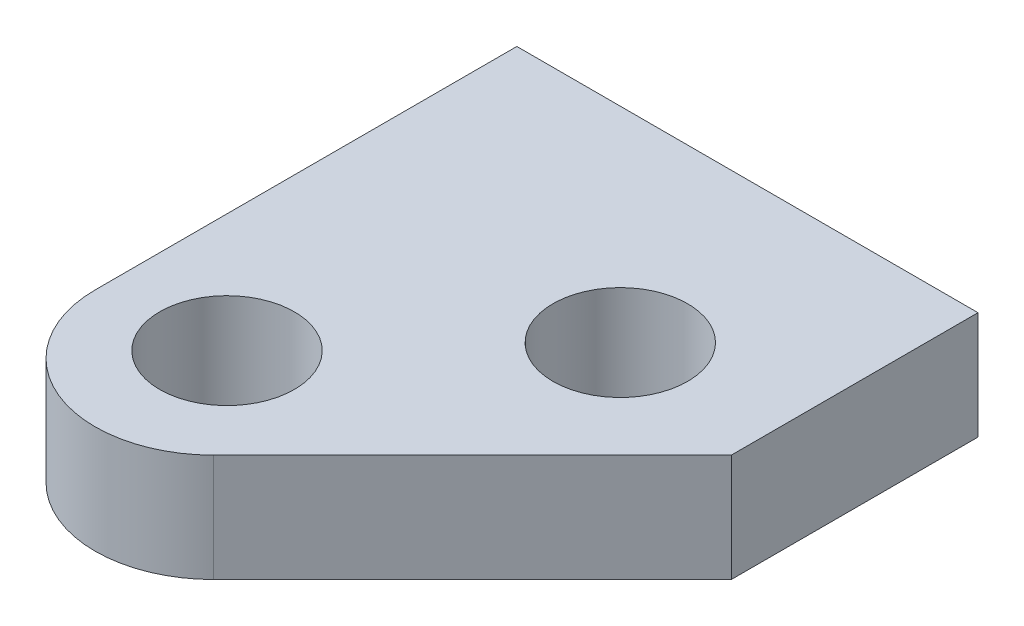
ISO-10303-21;
HEADER;
FILE_DESCRIPTION(('STEP AP214'),'2;1');
FILE_NAME('part.step','',(''),(''),'','','');
FILE_SCHEMA(('AUTOMOTIVE_DESIGN { 1 0 10303 214 1 1 1 1 }'));
ENDSEC;
DATA;
#1=APPLICATION_CONTEXT('core data for automotive mechanical design processes');
#2=APPLICATION_PROTOCOL_DEFINITION('international standard','automotive_design',2000,#1);
#3=PRODUCT_CONTEXT('',#1,'mechanical');
#4=PRODUCT('Part','Part','',(#3));
#5=PRODUCT_RELATED_PRODUCT_CATEGORY('part','',(#4));
#6=PRODUCT_DEFINITION_FORMATION('','',#4);
#7=PRODUCT_DEFINITION_CONTEXT('part definition',#1,'design');
#8=PRODUCT_DEFINITION('design','',#6,#7);
#9=PRODUCT_DEFINITION_SHAPE('','',#8);
#10=(LENGTH_UNIT() NAMED_UNIT(*) SI_UNIT(.MILLI.,.METRE.));
#11=(NAMED_UNIT(*) PLANE_ANGLE_UNIT() SI_UNIT($,.RADIAN.));
#12=(NAMED_UNIT(*) SI_UNIT($,.STERADIAN.) SOLID_ANGLE_UNIT());
#13=UNCERTAINTY_MEASURE_WITH_UNIT(LENGTH_MEASURE(1.E-05),#10,'distance_accuracy_value','');
#14=(GEOMETRIC_REPRESENTATION_CONTEXT(3) GLOBAL_UNCERTAINTY_ASSIGNED_CONTEXT((#13)) GLOBAL_UNIT_ASSIGNED_CONTEXT((#10,
#11,#12)) REPRESENTATION_CONTEXT('',''));
#15=CARTESIAN_POINT('',(0.,0.,0.));
#16=DIRECTION('',(0.,0.,1.));
#17=DIRECTION('',(1.,0.,0.));
#18=AXIS2_PLACEMENT_3D('',#15,#16,#17);
#19=CARTESIAN_POINT('',(0.,10.,0.));
#20=DIRECTION('',(0.,-1.,0.));
#21=DIRECTION('',(0.,0.,-1.));
#22=AXIS2_PLACEMENT_3D('',#19,#20,#21);
#23=PLANE('',#22);
#24=CARTESIAN_POINT('',(11.,10.,37.9));
#25=DIRECTION('',(0.,1.,0.));
#26=DIRECTION('',(0.,0.,1.));
#27=AXIS2_PLACEMENT_3D('',#24,#25,#26);
#28=CIRCLE('',#27,6.25);
#29=CARTESIAN_POINT('',(11.,10.,44.15));
#30=VERTEX_POINT('',#29);
#31=EDGE_CURVE('E118',#30,#30,#28,.T.);
#32=ORIENTED_EDGE('',*,*,#31,.F.);
#33=EDGE_LOOP('',(#32));
#34=FACE_BOUND('',#33,.T.);
#35=DIRECTION('',(0.,0.,1.));
#36=VECTOR('',#35,1.);
#37=CARTESIAN_POINT('',(0.,10.,0.));
#38=LINE('',#37,#36);
#39=CARTESIAN_POINT('',(0.,10.,0.));
#40=VERTEX_POINT('',#39);
#41=CARTESIAN_POINT('',(0.,10.,39.1436508138959));
#42=VERTEX_POINT('',#41);
#43=EDGE_CURVE('E78',#40,#42,#38,.T.);
#44=ORIENTED_EDGE('',*,*,#43,.T.);
#45=CARTESIAN_POINT('',(11.,10.,39.1436508138959));
#46=DIRECTION('',(0.,-1.,0.));
#47=DIRECTION('',(0.,0.,-1.));
#48=AXIS2_PLACEMENT_3D('',#45,#46,#47);
#49=CIRCLE('',#48,11.);
#50=CARTESIAN_POINT('',(18.778174593052,10.,46.9218254069479));
#51=VERTEX_POINT('',#50);
#52=EDGE_CURVE('E11',#42,#51,#49,.F.);
#53=ORIENTED_EDGE('',*,*,#52,.T.);
#54=DIRECTION('',(0.707106781186549,0.,-0.707106781186546));
#55=VECTOR('',#54,1.);
#56=CARTESIAN_POINT('',(42.8,10.,22.9));
#57=LINE('',#56,#55);
#58=CARTESIAN_POINT('',(42.8,10.,22.9));
#59=VERTEX_POINT('',#58);
#60=EDGE_CURVE('E86',#51,#59,#57,.T.);
#61=ORIENTED_EDGE('',*,*,#60,.T.);
#62=DIRECTION('',(0.,0.,-1.));
#63=VECTOR('',#62,1.);
#64=CARTESIAN_POINT('',(42.8,10.,0.));
#65=LINE('',#64,#63);
#66=CARTESIAN_POINT('',(42.8,10.,0.));
#67=VERTEX_POINT('',#66);
#68=EDGE_CURVE('E92',#59,#67,#65,.T.);
#69=ORIENTED_EDGE('',*,*,#68,.T.);
#70=DIRECTION('',(-1.,0.,0.));
#71=VECTOR('',#70,1.);
#72=CARTESIAN_POINT('',(0.,10.,0.));
#73=LINE('',#72,#71);
#74=EDGE_CURVE('E87',#67,#40,#73,.T.);
#75=ORIENTED_EDGE('',*,*,#74,.T.);
#76=EDGE_LOOP('',(#44,#53,#61,#69,#75));
#77=FACE_BOUND('',#76,.T.);
#78=CARTESIAN_POINT('',(28.6,10.,19.));
#79=DIRECTION('',(0.,1.,0.));
#80=DIRECTION('',(0.,0.,1.));
#81=AXIS2_PLACEMENT_3D('',#78,#79,#80);
#82=CIRCLE('',#81,6.25);
#83=CARTESIAN_POINT('',(28.6,10.,25.25));
#84=VERTEX_POINT('',#83);
#85=EDGE_CURVE('E124',#84,#84,#82,.T.);
#86=ORIENTED_EDGE('',*,*,#85,.F.);
#87=EDGE_LOOP('',(#86));
#88=FACE_BOUND('',#87,.T.);
#89=ADVANCED_FACE('F35',(#34,#77,#88),#23,.F.);
#90=CARTESIAN_POINT('',(0.,0.,0.));
#91=DIRECTION('',(0.,-1.,0.));
#92=DIRECTION('',(0.,0.,-1.));
#93=AXIS2_PLACEMENT_3D('',#90,#91,#92);
#94=PLANE('',#93);
#95=CARTESIAN_POINT('',(11.,0.,37.9));
#96=DIRECTION('',(0.,1.,0.));
#97=DIRECTION('',(0.,0.,1.));
#98=AXIS2_PLACEMENT_3D('',#95,#96,#97);
#99=CIRCLE('',#98,6.25);
#100=CARTESIAN_POINT('',(11.,0.,44.15));
#101=VERTEX_POINT('',#100);
#102=EDGE_CURVE('E121',#101,#101,#99,.T.);
#103=ORIENTED_EDGE('',*,*,#102,.T.);
#104=EDGE_LOOP('',(#103));
#105=FACE_BOUND('',#104,.T.);
#106=DIRECTION('',(0.707106781186549,0.,-0.707106781186546));
#107=VECTOR('',#106,1.);
#108=CARTESIAN_POINT('',(42.8,0.,22.9));
#109=LINE('',#108,#107);
#110=CARTESIAN_POINT('',(18.778174593052,0.,46.9218254069479));
#111=VERTEX_POINT('',#110);
#112=CARTESIAN_POINT('',(42.8,0.,22.9));
#113=VERTEX_POINT('',#112);
#114=EDGE_CURVE('E113',#111,#113,#109,.T.);
#115=ORIENTED_EDGE('',*,*,#114,.F.);
#116=CARTESIAN_POINT('',(11.,0.,39.1436508138959));
#117=DIRECTION('',(0.,-1.,0.));
#118=DIRECTION('',(0.,0.,-1.));
#119=AXIS2_PLACEMENT_3D('',#116,#117,#118);
#120=CIRCLE('',#119,11.);
#121=CARTESIAN_POINT('',(0.,0.,39.1436508138959));
#122=VERTEX_POINT('',#121);
#123=EDGE_CURVE('E57',#111,#122,#120,.T.);
#124=ORIENTED_EDGE('',*,*,#123,.T.);
#125=DIRECTION('',(0.,0.,1.));
#126=VECTOR('',#125,1.);
#127=CARTESIAN_POINT('',(0.,0.,37.9));
#128=LINE('',#127,#126);
#129=CARTESIAN_POINT('',(0.,0.,0.));
#130=VERTEX_POINT('',#129);
#131=EDGE_CURVE('E115',#130,#122,#128,.T.);
#132=ORIENTED_EDGE('',*,*,#131,.F.);
#133=DIRECTION('',(-1.,0.,0.));
#134=VECTOR('',#133,1.);
#135=CARTESIAN_POINT('',(0.,0.,0.));
#136=LINE('',#135,#134);
#137=CARTESIAN_POINT('',(42.8,0.,0.));
#138=VERTEX_POINT('',#137);
#139=EDGE_CURVE('E100',#138,#130,#136,.T.);
#140=ORIENTED_EDGE('',*,*,#139,.F.);
#141=DIRECTION('',(0.,0.,-1.));
#142=VECTOR('',#141,1.);
#143=CARTESIAN_POINT('',(42.8,0.,0.));
#144=LINE('',#143,#142);
#145=EDGE_CURVE('E96',#113,#138,#144,.T.);
#146=ORIENTED_EDGE('',*,*,#145,.F.);
#147=EDGE_LOOP('',(#115,#124,#132,#140,#146));
#148=FACE_BOUND('',#147,.T.);
#149=CARTESIAN_POINT('',(28.6,0.,19.));
#150=DIRECTION('',(0.,1.,0.));
#151=DIRECTION('',(0.,0.,1.));
#152=AXIS2_PLACEMENT_3D('',#149,#150,#151);
#153=CIRCLE('',#152,6.25);
#154=CARTESIAN_POINT('',(28.6,0.,25.25));
#155=VERTEX_POINT('',#154);
#156=EDGE_CURVE('E127',#155,#155,#153,.T.);
#157=ORIENTED_EDGE('',*,*,#156,.T.);
#158=EDGE_LOOP('',(#157));
#159=FACE_BOUND('',#158,.T.);
#160=ADVANCED_FACE('F175',(#105,#148,#159),#94,.T.);
#161=CARTESIAN_POINT('',(0.,10.,0.));
#162=DIRECTION('',(0.,0.,1.));
#163=DIRECTION('',(1.,0.,0.));
#164=AXIS2_PLACEMENT_3D('',#161,#162,#163);
#165=PLANE('',#164);
#166=ORIENTED_EDGE('',*,*,#139,.T.);
#167=DIRECTION('',(0.,-1.,0.));
#168=VECTOR('',#167,1.);
#169=CARTESIAN_POINT('',(0.,10.,0.));
#170=LINE('',#169,#168);
#171=EDGE_CURVE('E82',#40,#130,#170,.T.);
#172=ORIENTED_EDGE('',*,*,#171,.F.);
#173=ORIENTED_EDGE('',*,*,#74,.F.);
#174=DIRECTION('',(0.,-1.,0.));
#175=VECTOR('',#174,1.);
#176=CARTESIAN_POINT('',(42.8,10.,0.));
#177=LINE('',#176,#175);
#178=EDGE_CURVE('E107',#67,#138,#177,.T.);
#179=ORIENTED_EDGE('',*,*,#178,.T.);
#180=EDGE_LOOP('',(#166,#172,#173,#179));
#181=FACE_BOUND('',#180,.T.);
#182=ADVANCED_FACE('F98',(#181),#165,.F.);
#183=CARTESIAN_POINT('',(0.,10.,37.9));
#184=DIRECTION('',(1.,0.,0.));
#185=DIRECTION('',(0.,0.,-1.));
#186=AXIS2_PLACEMENT_3D('',#183,#184,#185);
#187=PLANE('',#186);
#188=CARTESIAN_POINT('',(0.,5.,9.));
#189=DIRECTION('',(-1.,0.,0.));
#190=DIRECTION('',(0.,0.,1.));
#191=AXIS2_PLACEMENT_3D('',#188,#189,#190);
#192=CIRCLE('',#191,1.86358892584463);
#193=CARTESIAN_POINT('',(0.,5.,10.8635889258446));
#194=VERTEX_POINT('',#193);
#195=EDGE_CURVE('E139',#194,#194,#192,.T.);
#196=ORIENTED_EDGE('',*,*,#195,.F.);
#197=EDGE_LOOP('',(#196));
#198=FACE_BOUND('',#197,.T.);
#199=CARTESIAN_POINT('',(0.,5.,3.));
#200=DIRECTION('',(-1.,0.,0.));
#201=DIRECTION('',(0.,0.,1.));
#202=AXIS2_PLACEMENT_3D('',#199,#200,#201);
#203=CIRCLE('',#202,1.86358892584463);
#204=CARTESIAN_POINT('',(0.,5.,4.86358892584463));
#205=VERTEX_POINT('',#204);
#206=EDGE_CURVE('E133',#205,#205,#203,.T.);
#207=ORIENTED_EDGE('',*,*,#206,.F.);
#208=EDGE_LOOP('',(#207));
#209=FACE_BOUND('',#208,.T.);
#210=ORIENTED_EDGE('',*,*,#131,.T.);
#211=DIRECTION('',(0.,-1.,0.));
#212=VECTOR('',#211,1.);
#213=CARTESIAN_POINT('',(0.,10.,39.1436508138959));
#214=LINE('',#213,#212);
#215=EDGE_CURVE('E43',#122,#42,#214,.F.);
#216=ORIENTED_EDGE('',*,*,#215,.T.);
#217=ORIENTED_EDGE('',*,*,#43,.F.);
#218=ORIENTED_EDGE('',*,*,#171,.T.);
#219=EDGE_LOOP('',(#210,#216,#217,#218));
#220=FACE_BOUND('',#219,.T.);
#221=ADVANCED_FACE('F80',(#198,#209,#220),#187,.F.);
#222=CARTESIAN_POINT('',(42.8,10.,22.9));
#223=DIRECTION('',(-0.707106781186546,0.,-0.707106781186549));
#224=DIRECTION('',(-0.707106781186549,0.,0.707106781186546));
#225=AXIS2_PLACEMENT_3D('',#222,#223,#224);
#226=PLANE('',#225);
#227=ORIENTED_EDGE('',*,*,#60,.F.);
#228=DIRECTION('',(0.,-1.,0.));
#229=VECTOR('',#228,1.);
#230=CARTESIAN_POINT('',(18.778174593052,10.,46.9218254069479));
#231=LINE('',#230,#229);
#232=EDGE_CURVE('E101',#51,#111,#231,.T.);
#233=ORIENTED_EDGE('',*,*,#232,.T.);
#234=ORIENTED_EDGE('',*,*,#114,.T.);
#235=DIRECTION('',(0.,-1.,0.));
#236=VECTOR('',#235,1.);
#237=CARTESIAN_POINT('',(42.8,10.,22.9));
#238=LINE('',#237,#236);
#239=EDGE_CURVE('E102',#59,#113,#238,.T.);
#240=ORIENTED_EDGE('',*,*,#239,.F.);
#241=EDGE_LOOP('',(#227,#233,#234,#240));
#242=FACE_BOUND('',#241,.T.);
#243=ADVANCED_FACE('F156',(#242),#226,.F.);
#244=CARTESIAN_POINT('',(42.8,10.,0.));
#245=DIRECTION('',(-1.,0.,0.));
#246=DIRECTION('',(0.,0.,1.));
#247=AXIS2_PLACEMENT_3D('',#244,#245,#246);
#248=PLANE('',#247);
#249=ORIENTED_EDGE('',*,*,#145,.T.);
#250=ORIENTED_EDGE('',*,*,#178,.F.);
#251=ORIENTED_EDGE('',*,*,#68,.F.);
#252=ORIENTED_EDGE('',*,*,#239,.T.);
#253=EDGE_LOOP('',(#249,#250,#251,#252));
#254=FACE_BOUND('',#253,.T.);
#255=ADVANCED_FACE('F187',(#254),#248,.F.);
#256=CARTESIAN_POINT('',(11.,10.,37.9));
#257=DIRECTION('',(0.,-1.,0.));
#258=DIRECTION('',(0.,0.,-1.));
#259=AXIS2_PLACEMENT_3D('',#256,#257,#258);
#260=CYLINDRICAL_SURFACE('',#259,6.25);
#261=ORIENTED_EDGE('',*,*,#31,.T.);
#262=EDGE_LOOP('',(#261));
#263=FACE_BOUND('',#262,.T.);
#264=ORIENTED_EDGE('',*,*,#102,.F.);
#265=EDGE_LOOP('',(#264));
#266=FACE_BOUND('',#265,.T.);
#267=ADVANCED_FACE('F185',(#263,#266),#260,.F.);
#268=CARTESIAN_POINT('',(28.6,10.,19.));
#269=DIRECTION('',(0.,-1.,0.));
#270=DIRECTION('',(0.,0.,-1.));
#271=AXIS2_PLACEMENT_3D('',#268,#269,#270);
#272=CYLINDRICAL_SURFACE('',#271,6.25);
#273=ORIENTED_EDGE('',*,*,#85,.T.);
#274=EDGE_LOOP('',(#273));
#275=FACE_BOUND('',#274,.T.);
#276=ORIENTED_EDGE('',*,*,#156,.F.);
#277=EDGE_LOOP('',(#276));
#278=FACE_BOUND('',#277,.T.);
#279=ADVANCED_FACE('F170',(#275,#278),#272,.F.);
#280=CARTESIAN_POINT('',(11.,10.,39.1436508138959));
#281=DIRECTION('',(0.,-1.,0.));
#282=DIRECTION('',(0.,0.,-1.));
#283=AXIS2_PLACEMENT_3D('',#280,#281,#282);
#284=CYLINDRICAL_SURFACE('',#283,11.);
#285=ORIENTED_EDGE('',*,*,#52,.F.);
#286=ORIENTED_EDGE('',*,*,#215,.F.);
#287=ORIENTED_EDGE('',*,*,#123,.F.);
#288=ORIENTED_EDGE('',*,*,#232,.F.);
#289=EDGE_LOOP('',(#285,#286,#287,#288));
#290=FACE_BOUND('',#289,.T.);
#291=ADVANCED_FACE('F37',(#290),#284,.T.);
#292=CARTESIAN_POINT('',(10.,5.,3.));
#293=DIRECTION('',(-1.,0.,0.));
#294=DIRECTION('',(0.,0.,1.));
#295=AXIS2_PLACEMENT_3D('',#292,#293,#294);
#296=CYLINDRICAL_SURFACE('',#295,1.86358892584463);
#297=CARTESIAN_POINT('',(10.,5.,3.));
#298=DIRECTION('',(-1.,0.,0.));
#299=DIRECTION('',(0.,0.,1.));
#300=AXIS2_PLACEMENT_3D('',#297,#298,#299);
#301=CIRCLE('',#300,1.86358892584463);
#302=CARTESIAN_POINT('',(10.,5.,4.86358892584463));
#303=VERTEX_POINT('',#302);
#304=EDGE_CURVE('E130',#303,#303,#301,.T.);
#305=ORIENTED_EDGE('',*,*,#304,.F.);
#306=EDGE_LOOP('',(#305));
#307=FACE_BOUND('',#306,.T.);
#308=ORIENTED_EDGE('',*,*,#206,.T.);
#309=EDGE_LOOP('',(#308));
#310=FACE_BOUND('',#309,.T.);
#311=ADVANCED_FACE('F160',(#307,#310),#296,.F.);
#312=CARTESIAN_POINT('',(10.,5.,3.));
#313=DIRECTION('',(-1.,0.,0.));
#314=DIRECTION('',(0.,0.,1.));
#315=AXIS2_PLACEMENT_3D('',#312,#313,#314);
#316=PLANE('',#315);
#317=ORIENTED_EDGE('',*,*,#304,.T.);
#318=EDGE_LOOP('',(#317));
#319=FACE_BOUND('',#318,.T.);
#320=ADVANCED_FACE('F150',(#319),#316,.T.);
#321=CARTESIAN_POINT('',(10.,5.,9.));
#322=DIRECTION('',(-1.,0.,0.));
#323=DIRECTION('',(0.,0.,1.));
#324=AXIS2_PLACEMENT_3D('',#321,#322,#323);
#325=CYLINDRICAL_SURFACE('',#324,1.86358892584463);
#326=CARTESIAN_POINT('',(10.,5.,9.));
#327=DIRECTION('',(-1.,0.,0.));
#328=DIRECTION('',(0.,0.,1.));
#329=AXIS2_PLACEMENT_3D('',#326,#327,#328);
#330=CIRCLE('',#329,1.86358892584463);
#331=CARTESIAN_POINT('',(10.,5.,10.8635889258446));
#332=VERTEX_POINT('',#331);
#333=EDGE_CURVE('E136',#332,#332,#330,.T.);
#334=ORIENTED_EDGE('',*,*,#333,.F.);
#335=EDGE_LOOP('',(#334));
#336=FACE_BOUND('',#335,.T.);
#337=ORIENTED_EDGE('',*,*,#195,.T.);
#338=EDGE_LOOP('',(#337));
#339=FACE_BOUND('',#338,.T.);
#340=ADVANCED_FACE('F147',(#336,#339),#325,.F.);
#341=CARTESIAN_POINT('',(10.,5.,9.));
#342=DIRECTION('',(-1.,0.,0.));
#343=DIRECTION('',(0.,0.,1.));
#344=AXIS2_PLACEMENT_3D('',#341,#342,#343);
#345=PLANE('',#344);
#346=ORIENTED_EDGE('',*,*,#333,.T.);
#347=EDGE_LOOP('',(#346));
#348=FACE_BOUND('',#347,.T.);
#349=ADVANCED_FACE('F145',(#348),#345,.T.);
#350=CLOSED_SHELL('',(#89,#160,#182,#221,#243,#255,#267,#279,#291,#311,#320,#340,#349));
#351=MANIFOLD_SOLID_BREP('B2',#350);
#352=ADVANCED_BREP_SHAPE_REPRESENTATION('',(#18,#351),#14);
#353=SHAPE_DEFINITION_REPRESENTATION(#9,#352);
ENDSEC;
END-ISO-10303-21;
